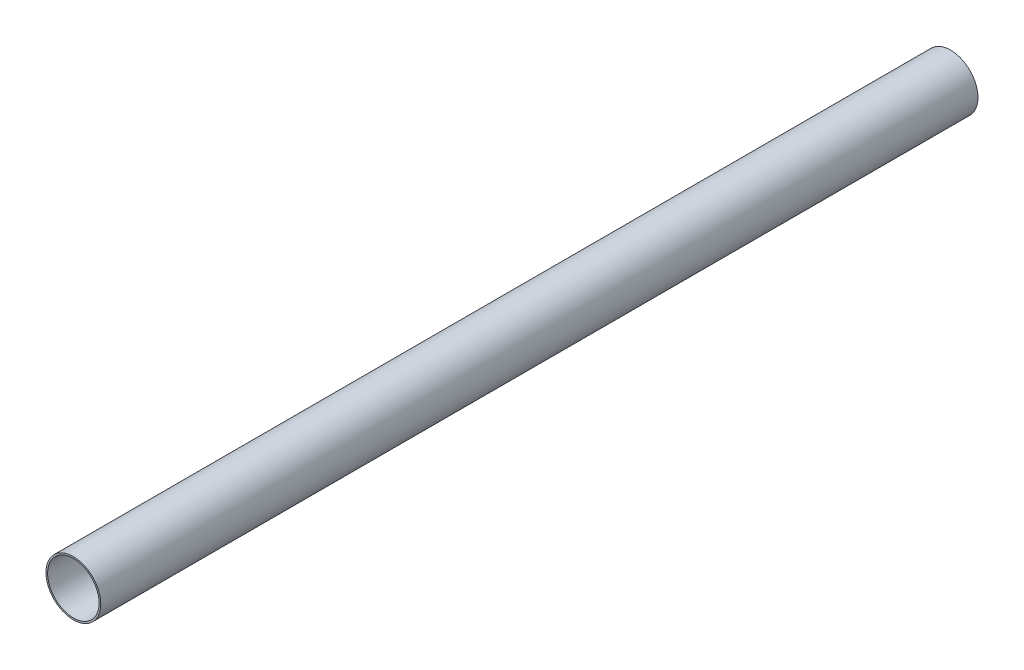
ISO-10303-21;
HEADER;
FILE_DESCRIPTION(('STEP AP214'),'2;1');
FILE_NAME('part.step','',(''),(''),'','','');
FILE_SCHEMA(('AUTOMOTIVE_DESIGN { 1 0 10303 214 1 1 1 1 }'));
ENDSEC;
DATA;
#1=APPLICATION_CONTEXT('core data for automotive mechanical design processes');
#2=APPLICATION_PROTOCOL_DEFINITION('international standard','automotive_design',2000,#1);
#3=PRODUCT_CONTEXT('',#1,'mechanical');
#4=PRODUCT('Part','Part','',(#3));
#5=PRODUCT_RELATED_PRODUCT_CATEGORY('part','',(#4));
#6=PRODUCT_DEFINITION_FORMATION('','',#4);
#7=PRODUCT_DEFINITION_CONTEXT('part definition',#1,'design');
#8=PRODUCT_DEFINITION('design','',#6,#7);
#9=PRODUCT_DEFINITION_SHAPE('','',#8);
#10=(LENGTH_UNIT() NAMED_UNIT(*) SI_UNIT(.MILLI.,.METRE.));
#11=(NAMED_UNIT(*) PLANE_ANGLE_UNIT() SI_UNIT($,.RADIAN.));
#12=(NAMED_UNIT(*) SI_UNIT($,.STERADIAN.) SOLID_ANGLE_UNIT());
#13=UNCERTAINTY_MEASURE_WITH_UNIT(LENGTH_MEASURE(1.E-05),#10,'distance_accuracy_value','');
#14=(GEOMETRIC_REPRESENTATION_CONTEXT(3) GLOBAL_UNCERTAINTY_ASSIGNED_CONTEXT((#13)) GLOBAL_UNIT_ASSIGNED_CONTEXT((#10,
#11,#12)) REPRESENTATION_CONTEXT('',''));
#15=CARTESIAN_POINT('',(0.,0.,0.));
#16=DIRECTION('',(0.,0.,1.));
#17=DIRECTION('',(1.,0.,0.));
#18=AXIS2_PLACEMENT_3D('',#15,#16,#17);
#19=CARTESIAN_POINT('',(0.,0.,1600.));
#20=DIRECTION('',(0.,0.,1.));
#21=DIRECTION('',(1.,0.,0.));
#22=AXIS2_PLACEMENT_3D('',#19,#20,#21);
#23=PLANE('',#22);
#24=CARTESIAN_POINT('',(0.,0.,1600.));
#25=DIRECTION('',(0.,0.,1.));
#26=DIRECTION('',(1.,0.,0.));
#27=AXIS2_PLACEMENT_3D('',#24,#25,#26);
#28=CIRCLE('',#27,50.);
#29=CARTESIAN_POINT('',(50.,0.,1600.));
#30=VERTEX_POINT('',#29);
#31=EDGE_CURVE('E10',#30,#30,#28,.T.);
#32=ORIENTED_EDGE('',*,*,#31,.T.);
#33=EDGE_LOOP('',(#32));
#34=FACE_BOUND('',#33,.T.);
#35=CARTESIAN_POINT('',(0.,0.,1600.));
#36=DIRECTION('',(0.,0.,1.));
#37=DIRECTION('',(1.,0.,0.));
#38=AXIS2_PLACEMENT_3D('',#35,#36,#37);
#39=CIRCLE('',#38,47.);
#40=CARTESIAN_POINT('',(47.,0.,1600.));
#41=VERTEX_POINT('',#40);
#42=EDGE_CURVE('E41',#41,#41,#39,.T.);
#43=ORIENTED_EDGE('',*,*,#42,.F.);
#44=EDGE_LOOP('',(#43));
#45=FACE_BOUND('',#44,.T.);
#46=ADVANCED_FACE('F30',(#34,#45),#23,.T.);
#47=CARTESIAN_POINT('',(0.,0.,0.));
#48=DIRECTION('',(0.,0.,1.));
#49=DIRECTION('',(1.,0.,0.));
#50=AXIS2_PLACEMENT_3D('',#47,#48,#49);
#51=PLANE('',#50);
#52=CARTESIAN_POINT('',(0.,0.,0.));
#53=DIRECTION('',(0.,0.,1.));
#54=DIRECTION('',(1.,0.,0.));
#55=AXIS2_PLACEMENT_3D('',#52,#53,#54);
#56=CIRCLE('',#55,50.);
#57=CARTESIAN_POINT('',(50.,0.,0.));
#58=VERTEX_POINT('',#57);
#59=EDGE_CURVE('E34',#58,#58,#56,.T.);
#60=ORIENTED_EDGE('',*,*,#59,.F.);
#61=EDGE_LOOP('',(#60));
#62=FACE_BOUND('',#61,.T.);
#63=CARTESIAN_POINT('',(0.,0.,0.));
#64=DIRECTION('',(0.,0.,1.));
#65=DIRECTION('',(1.,0.,0.));
#66=AXIS2_PLACEMENT_3D('',#63,#64,#65);
#67=CIRCLE('',#66,47.);
#68=CARTESIAN_POINT('',(47.,0.,0.));
#69=VERTEX_POINT('',#68);
#70=EDGE_CURVE('E43',#69,#69,#67,.T.);
#71=ORIENTED_EDGE('',*,*,#70,.T.);
#72=EDGE_LOOP('',(#71));
#73=FACE_BOUND('',#72,.T.);
#74=ADVANCED_FACE('F53',(#62,#73),#51,.F.);
#75=CARTESIAN_POINT('',(0.,0.,1600.));
#76=DIRECTION('',(0.,0.,-1.));
#77=DIRECTION('',(-1.,0.,0.));
#78=AXIS2_PLACEMENT_3D('',#75,#76,#77);
#79=CYLINDRICAL_SURFACE('',#78,50.);
#80=ORIENTED_EDGE('',*,*,#31,.F.);
#81=EDGE_LOOP('',(#80));
#82=FACE_BOUND('',#81,.T.);
#83=ORIENTED_EDGE('',*,*,#59,.T.);
#84=EDGE_LOOP('',(#83));
#85=FACE_BOUND('',#84,.T.);
#86=ADVANCED_FACE('F32',(#82,#85),#79,.T.);
#87=CARTESIAN_POINT('',(0.,0.,1600.));
#88=DIRECTION('',(0.,0.,-1.));
#89=DIRECTION('',(-1.,0.,0.));
#90=AXIS2_PLACEMENT_3D('',#87,#88,#89);
#91=CYLINDRICAL_SURFACE('',#90,47.);
#92=ORIENTED_EDGE('',*,*,#42,.T.);
#93=EDGE_LOOP('',(#92));
#94=FACE_BOUND('',#93,.T.);
#95=ORIENTED_EDGE('',*,*,#70,.F.);
#96=EDGE_LOOP('',(#95));
#97=FACE_BOUND('',#96,.T.);
#98=ADVANCED_FACE('F49',(#94,#97),#91,.F.);
#99=CLOSED_SHELL('',(#46,#74,#86,#98));
#100=MANIFOLD_SOLID_BREP('B2',#99);
#101=ADVANCED_BREP_SHAPE_REPRESENTATION('',(#18,#100),#14);
#102=SHAPE_DEFINITION_REPRESENTATION(#9,#101);
ENDSEC;
END-ISO-10303-21;
